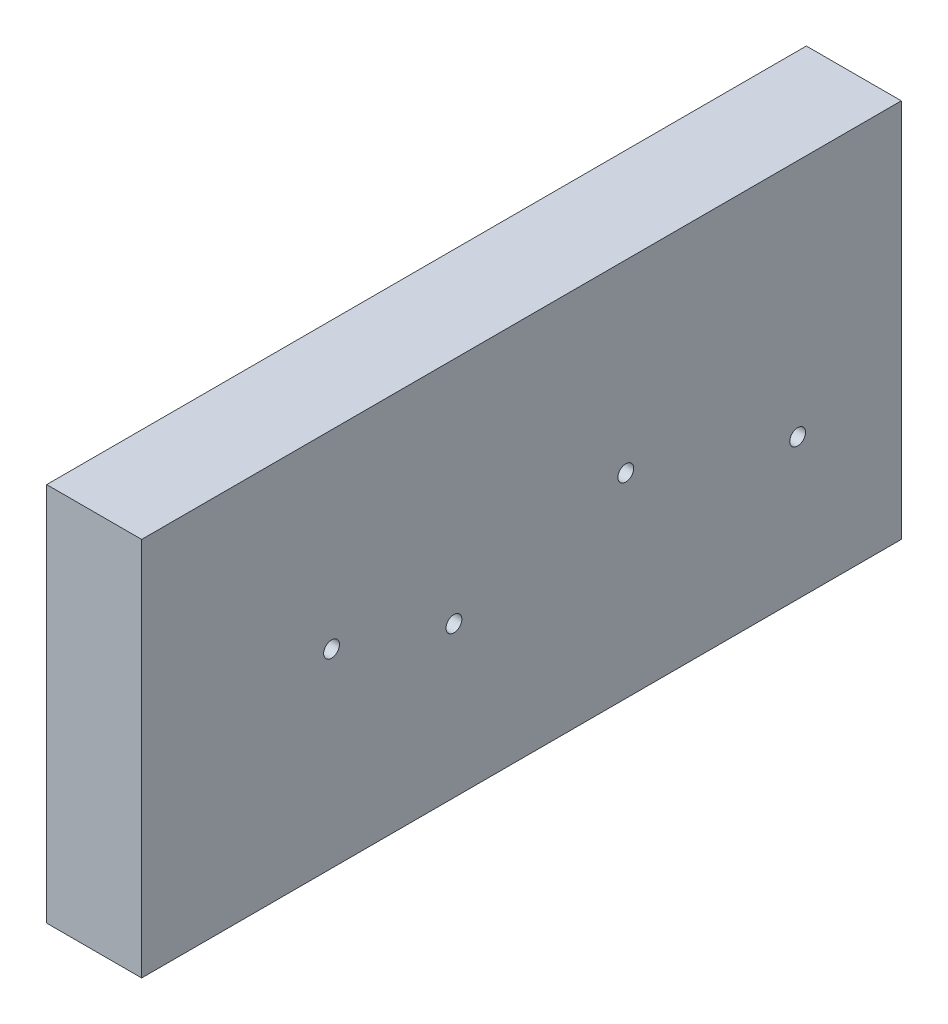
ISO-10303-21;
HEADER;
FILE_DESCRIPTION(('STEP AP214'),'2;1');
FILE_NAME('part.step','',(''),(''),'','','');
FILE_SCHEMA(('AUTOMOTIVE_DESIGN { 1 0 10303 214 1 1 1 1 }'));
ENDSEC;
DATA;
#1=APPLICATION_CONTEXT('core data for automotive mechanical design processes');
#2=APPLICATION_PROTOCOL_DEFINITION('international standard','automotive_design',2000,#1);
#3=PRODUCT_CONTEXT('',#1,'mechanical');
#4=PRODUCT('Part','Part','',(#3));
#5=PRODUCT_RELATED_PRODUCT_CATEGORY('part','',(#4));
#6=PRODUCT_DEFINITION_FORMATION('','',#4);
#7=PRODUCT_DEFINITION_CONTEXT('part definition',#1,'design');
#8=PRODUCT_DEFINITION('design','',#6,#7);
#9=PRODUCT_DEFINITION_SHAPE('','',#8);
#10=(LENGTH_UNIT() NAMED_UNIT(*) SI_UNIT(.MILLI.,.METRE.));
#11=(NAMED_UNIT(*) PLANE_ANGLE_UNIT() SI_UNIT($,.RADIAN.));
#12=(NAMED_UNIT(*) SI_UNIT($,.STERADIAN.) SOLID_ANGLE_UNIT());
#13=UNCERTAINTY_MEASURE_WITH_UNIT(LENGTH_MEASURE(1.E-05),#10,'distance_accuracy_value','');
#14=(GEOMETRIC_REPRESENTATION_CONTEXT(3) GLOBAL_UNCERTAINTY_ASSIGNED_CONTEXT((#13)) GLOBAL_UNIT_ASSIGNED_CONTEXT((#10,
#11,#12)) REPRESENTATION_CONTEXT('',''));
#15=CARTESIAN_POINT('',(0.,0.,0.));
#16=DIRECTION('',(0.,0.,1.));
#17=DIRECTION('',(1.,0.,0.));
#18=AXIS2_PLACEMENT_3D('',#15,#16,#17);
#19=CARTESIAN_POINT('',(19.05,-9.873506971,-55.404));
#20=DIRECTION('',(-1.,0.,0.));
#21=DIRECTION('',(0.,0.,1.));
#22=AXIS2_PLACEMENT_3D('',#19,#20,#21);
#23=CYLINDRICAL_SURFACE('',#22,1.5875);
#24=CARTESIAN_POINT('',(19.05,-9.873506971,-55.404));
#25=DIRECTION('',(1.,0.,0.));
#26=DIRECTION('',(0.,0.,-1.));
#27=AXIS2_PLACEMENT_3D('',#24,#25,#26);
#28=CIRCLE('',#27,1.5875);
#29=CARTESIAN_POINT('',(19.05,-9.873506971,-53.8165));
#30=VERTEX_POINT('',#29);
#31=EDGE_CURVE('E191',#30,#30,#28,.T.);
#32=CARTESIAN_POINT('',(6.35,-9.873506971,-55.404));
#33=DIRECTION('',(-1.,0.,0.));
#34=DIRECTION('',(0.,0.,1.));
#35=AXIS2_PLACEMENT_3D('',#32,#33,#34);
#36=CIRCLE('',#35,1.5875);
#37=CARTESIAN_POINT('',(6.35,-9.873506971,-53.8165));
#38=VERTEX_POINT('',#37);
#39=EDGE_CURVE('E51',#38,#38,#36,.T.);
#40=CARTESIAN_POINT('',(19.05,-9.873506971,-53.8165));
#41=CARTESIAN_POINT('',(18.9177083333333,-9.873506971,-53.8165));
#42=CARTESIAN_POINT('',(18.7854166666667,-9.873506971,-53.8165));
#43=CARTESIAN_POINT('',(18.5208333333333,-9.873506971,-53.8165));
#44=CARTESIAN_POINT('',(18.3885416666667,-9.873506971,-53.8165));
#45=CARTESIAN_POINT('',(18.1239583333333,-9.873506971,-53.8165));
#46=CARTESIAN_POINT('',(17.9916666666667,-9.873506971,-53.8165));
#47=CARTESIAN_POINT('',(17.7270833333333,-9.873506971,-53.8165));
#48=CARTESIAN_POINT('',(17.5947916666667,-9.873506971,-53.8165));
#49=CARTESIAN_POINT('',(17.3302083333333,-9.873506971,-53.8165));
#50=CARTESIAN_POINT('',(17.1979166666667,-9.873506971,-53.8165));
#51=CARTESIAN_POINT('',(16.9333333333333,-9.873506971,-53.8165));
#52=CARTESIAN_POINT('',(16.8010416666667,-9.873506971,-53.8165));
#53=CARTESIAN_POINT('',(16.5364583333333,-9.873506971,-53.8165));
#54=CARTESIAN_POINT('',(16.4041666666667,-9.873506971,-53.8165));
#55=CARTESIAN_POINT('',(16.1395833333333,-9.873506971,-53.8165));
#56=CARTESIAN_POINT('',(16.0072916666667,-9.873506971,-53.8165));
#57=CARTESIAN_POINT('',(15.7427083333333,-9.873506971,-53.8165));
#58=CARTESIAN_POINT('',(15.6104166666667,-9.873506971,-53.8165));
#59=CARTESIAN_POINT('',(15.3458333333333,-9.873506971,-53.8165));
#60=CARTESIAN_POINT('',(15.2135416666667,-9.873506971,-53.8165));
#61=CARTESIAN_POINT('',(14.9489583333333,-9.873506971,-53.8165));
#62=CARTESIAN_POINT('',(14.8166666666667,-9.873506971,-53.8165));
#63=CARTESIAN_POINT('',(14.5520833333333,-9.873506971,-53.8165));
#64=CARTESIAN_POINT('',(14.4197916666667,-9.873506971,-53.8165));
#65=CARTESIAN_POINT('',(14.1552083333333,-9.873506971,-53.8165));
#66=CARTESIAN_POINT('',(14.0229166666667,-9.873506971,-53.8165));
#67=CARTESIAN_POINT('',(13.7583333333333,-9.873506971,-53.8165));
#68=CARTESIAN_POINT('',(13.6260416666667,-9.873506971,-53.8165));
#69=CARTESIAN_POINT('',(13.3614583333333,-9.873506971,-53.8165));
#70=CARTESIAN_POINT('',(13.2291666666667,-9.873506971,-53.8165));
#71=CARTESIAN_POINT('',(12.9645833333333,-9.873506971,-53.8165));
#72=CARTESIAN_POINT('',(12.8322916666667,-9.873506971,-53.8165));
#73=CARTESIAN_POINT('',(12.5677083333333,-9.873506971,-53.8165));
#74=CARTESIAN_POINT('',(12.4354166666667,-9.873506971,-53.8165));
#75=CARTESIAN_POINT('',(12.1708333333333,-9.873506971,-53.8165));
#76=CARTESIAN_POINT('',(12.0385416666667,-9.873506971,-53.8165));
#77=CARTESIAN_POINT('',(11.7739583333333,-9.873506971,-53.8165));
#78=CARTESIAN_POINT('',(11.6416666666667,-9.873506971,-53.8165));
#79=CARTESIAN_POINT('',(11.3770833333333,-9.873506971,-53.8165));
#80=CARTESIAN_POINT('',(11.2447916666667,-9.873506971,-53.8165));
#81=CARTESIAN_POINT('',(10.9802083333333,-9.873506971,-53.8165));
#82=CARTESIAN_POINT('',(10.8479166666667,-9.873506971,-53.8165));
#83=CARTESIAN_POINT('',(10.5833333333333,-9.873506971,-53.8165));
#84=CARTESIAN_POINT('',(10.4510416666667,-9.873506971,-53.8165));
#85=CARTESIAN_POINT('',(10.1864583333333,-9.873506971,-53.8165));
#86=CARTESIAN_POINT('',(10.0541666666667,-9.873506971,-53.8165));
#87=CARTESIAN_POINT('',(9.78958333333333,-9.873506971,-53.8165));
#88=CARTESIAN_POINT('',(9.65729166666667,-9.873506971,-53.8165));
#89=CARTESIAN_POINT('',(9.39270833333333,-9.873506971,-53.8165));
#90=CARTESIAN_POINT('',(9.26041666666667,-9.873506971,-53.8165));
#91=CARTESIAN_POINT('',(8.99583333333333,-9.873506971,-53.8165));
#92=CARTESIAN_POINT('',(8.86354166666667,-9.873506971,-53.8165));
#93=CARTESIAN_POINT('',(8.59895833333333,-9.873506971,-53.8165));
#94=CARTESIAN_POINT('',(8.46666666666667,-9.873506971,-53.8165));
#95=CARTESIAN_POINT('',(8.20208333333333,-9.873506971,-53.8165));
#96=CARTESIAN_POINT('',(8.06979166666667,-9.873506971,-53.8165));
#97=CARTESIAN_POINT('',(7.80520833333333,-9.873506971,-53.8165));
#98=CARTESIAN_POINT('',(7.67291666666667,-9.873506971,-53.8165));
#99=CARTESIAN_POINT('',(7.40833333333333,-9.873506971,-53.8165));
#100=CARTESIAN_POINT('',(7.27604166666667,-9.873506971,-53.8165));
#101=CARTESIAN_POINT('',(7.01145833333333,-9.873506971,-53.8165));
#102=CARTESIAN_POINT('',(6.87916666666667,-9.873506971,-53.8165));
#103=CARTESIAN_POINT('',(6.61458333333333,-9.873506971,-53.8165));
#104=CARTESIAN_POINT('',(6.48229166666667,-9.873506971,-53.8165));
#105=CARTESIAN_POINT('',(6.35,-9.873506971,-53.8165));
#106=B_SPLINE_CURVE_WITH_KNOTS('',3,(#40,#41,#42,#43,#44,#45,#46,#47,#48,#49,#50,#51,#52,#53,
#54,#55,#56,#57,#58,#59,#60,#61,#62,#63,#64,#65,#66,#67,#68,#69,#70,#71,#72,#73,#74,#75,#76,#77,
#78,#79,#80,#81,#82,#83,#84,#85,#86,#87,#88,#89,#90,#91,#92,#93,#94,#95,#96,#97,#98,#99,#100,
#101,#102,#103,#104,#105),.UNSPECIFIED.,.F.,.F.,(4,2,2,2,2,2,2,2,2,2,2,2,2,2,2,2,2,2,2,2,2,2,2,
2,2,2,2,2,2,2,2,2,4),(0.,0.396875000000001,0.793750000000003,1.190625,1.5875,1.984375,2.38125,
2.778125,3.175,3.571875,3.96875,4.365625,4.7625,5.159375,5.55625,5.953125,6.35,6.746875,7.14375,
7.540625,7.9375,8.334375,8.73125,9.128125,9.525,9.921875,10.31875,10.715625,11.1125,11.509375,
11.90625,12.303125,12.7),.UNSPECIFIED.);
#107=EDGE_CURVE('BSEAM47',#30,#38,#106,.T.);
#108=ORIENTED_EDGE('',*,*,#31,.T.);
#109=ORIENTED_EDGE('',*,*,#39,.T.);
#110=ORIENTED_EDGE('',*,*,#107,.T.);
#111=ORIENTED_EDGE('',*,*,#107,.F.);
#112=EDGE_LOOP('',(#108,#110,#109,#111));
#113=FACE_BOUND('',#112,.T.);
#114=ADVANCED_FACE('F47',(#113),#23,.F.);
#115=CARTESIAN_POINT('',(19.05,0.,38.1));
#116=DIRECTION('',(-1.,0.,0.));
#117=DIRECTION('',(0.,0.,1.));
#118=AXIS2_PLACEMENT_3D('',#115,#116,#117);
#119=CYLINDRICAL_SURFACE('',#118,1.5875);
#120=CARTESIAN_POINT('',(19.05,0.,38.1));
#121=DIRECTION('',(1.,0.,0.));
#122=DIRECTION('',(0.,0.,-1.));
#123=AXIS2_PLACEMENT_3D('',#120,#121,#122);
#124=CIRCLE('',#123,1.5875);
#125=CARTESIAN_POINT('',(19.05,0.,39.6875));
#126=VERTEX_POINT('',#125);
#127=EDGE_CURVE('E187',#126,#126,#124,.T.);
#128=CARTESIAN_POINT('',(6.35,0.,38.1));
#129=DIRECTION('',(-1.,0.,0.));
#130=DIRECTION('',(0.,0.,1.));
#131=AXIS2_PLACEMENT_3D('',#128,#129,#130);
#132=CIRCLE('',#131,1.5875);
#133=CARTESIAN_POINT('',(6.35,0.,39.6875));
#134=VERTEX_POINT('',#133);
#135=EDGE_CURVE('E225',#134,#134,#132,.T.);
#136=CARTESIAN_POINT('',(19.05,0.,39.6875));
#137=CARTESIAN_POINT('',(18.9177083333333,0.,39.6875));
#138=CARTESIAN_POINT('',(18.7854166666667,0.,39.6875));
#139=CARTESIAN_POINT('',(18.5208333333333,0.,39.6875));
#140=CARTESIAN_POINT('',(18.3885416666667,0.,39.6875));
#141=CARTESIAN_POINT('',(18.1239583333333,0.,39.6875));
#142=CARTESIAN_POINT('',(17.9916666666667,0.,39.6875));
#143=CARTESIAN_POINT('',(17.7270833333333,0.,39.6875));
#144=CARTESIAN_POINT('',(17.5947916666667,0.,39.6875));
#145=CARTESIAN_POINT('',(17.3302083333333,0.,39.6875));
#146=CARTESIAN_POINT('',(17.1979166666667,0.,39.6875));
#147=CARTESIAN_POINT('',(16.9333333333333,0.,39.6875));
#148=CARTESIAN_POINT('',(16.8010416666667,0.,39.6875));
#149=CARTESIAN_POINT('',(16.5364583333333,0.,39.6875));
#150=CARTESIAN_POINT('',(16.4041666666667,0.,39.6875));
#151=CARTESIAN_POINT('',(16.1395833333333,0.,39.6875));
#152=CARTESIAN_POINT('',(16.0072916666667,0.,39.6875));
#153=CARTESIAN_POINT('',(15.7427083333333,0.,39.6875));
#154=CARTESIAN_POINT('',(15.6104166666667,0.,39.6875));
#155=CARTESIAN_POINT('',(15.3458333333333,0.,39.6875));
#156=CARTESIAN_POINT('',(15.2135416666667,0.,39.6875));
#157=CARTESIAN_POINT('',(14.9489583333333,0.,39.6875));
#158=CARTESIAN_POINT('',(14.8166666666667,0.,39.6875));
#159=CARTESIAN_POINT('',(14.5520833333333,0.,39.6875));
#160=CARTESIAN_POINT('',(14.4197916666667,0.,39.6875));
#161=CARTESIAN_POINT('',(14.1552083333333,0.,39.6875));
#162=CARTESIAN_POINT('',(14.0229166666667,0.,39.6875));
#163=CARTESIAN_POINT('',(13.7583333333333,0.,39.6875));
#164=CARTESIAN_POINT('',(13.6260416666667,0.,39.6875));
#165=CARTESIAN_POINT('',(13.3614583333333,0.,39.6875));
#166=CARTESIAN_POINT('',(13.2291666666667,0.,39.6875));
#167=CARTESIAN_POINT('',(12.9645833333333,0.,39.6875));
#168=CARTESIAN_POINT('',(12.8322916666667,0.,39.6875));
#169=CARTESIAN_POINT('',(12.5677083333333,0.,39.6875));
#170=CARTESIAN_POINT('',(12.4354166666667,0.,39.6875));
#171=CARTESIAN_POINT('',(12.1708333333333,0.,39.6875));
#172=CARTESIAN_POINT('',(12.0385416666667,0.,39.6875));
#173=CARTESIAN_POINT('',(11.7739583333333,0.,39.6875));
#174=CARTESIAN_POINT('',(11.6416666666667,0.,39.6875));
#175=CARTESIAN_POINT('',(11.3770833333333,0.,39.6875));
#176=CARTESIAN_POINT('',(11.2447916666667,0.,39.6875));
#177=CARTESIAN_POINT('',(10.9802083333333,0.,39.6875));
#178=CARTESIAN_POINT('',(10.8479166666667,0.,39.6875));
#179=CARTESIAN_POINT('',(10.5833333333333,0.,39.6875));
#180=CARTESIAN_POINT('',(10.4510416666667,0.,39.6875));
#181=CARTESIAN_POINT('',(10.1864583333333,0.,39.6875));
#182=CARTESIAN_POINT('',(10.0541666666667,0.,39.6875));
#183=CARTESIAN_POINT('',(9.78958333333333,0.,39.6875));
#184=CARTESIAN_POINT('',(9.65729166666667,0.,39.6875));
#185=CARTESIAN_POINT('',(9.39270833333333,0.,39.6875));
#186=CARTESIAN_POINT('',(9.26041666666667,0.,39.6875));
#187=CARTESIAN_POINT('',(8.99583333333333,0.,39.6875));
#188=CARTESIAN_POINT('',(8.86354166666667,0.,39.6875));
#189=CARTESIAN_POINT('',(8.59895833333333,0.,39.6875));
#190=CARTESIAN_POINT('',(8.46666666666667,0.,39.6875));
#191=CARTESIAN_POINT('',(8.20208333333333,0.,39.6875));
#192=CARTESIAN_POINT('',(8.06979166666667,0.,39.6875));
#193=CARTESIAN_POINT('',(7.80520833333333,0.,39.6875));
#194=CARTESIAN_POINT('',(7.67291666666667,0.,39.6875));
#195=CARTESIAN_POINT('',(7.40833333333333,0.,39.6875));
#196=CARTESIAN_POINT('',(7.27604166666667,0.,39.6875));
#197=CARTESIAN_POINT('',(7.01145833333333,0.,39.6875));
#198=CARTESIAN_POINT('',(6.87916666666667,0.,39.6875));
#199=CARTESIAN_POINT('',(6.61458333333333,0.,39.6875));
#200=CARTESIAN_POINT('',(6.48229166666667,0.,39.6875));
#201=CARTESIAN_POINT('',(6.35,0.,39.6875));
#202=B_SPLINE_CURVE_WITH_KNOTS('',3,(#136,#137,#138,#139,#140,#141,#142,#143,#144,#145,#146,
#147,#148,#149,#150,#151,#152,#153,#154,#155,#156,#157,#158,#159,#160,#161,#162,#163,#164,#165,
#166,#167,#168,#169,#170,#171,#172,#173,#174,#175,#176,#177,#178,#179,#180,#181,#182,#183,#184,
#185,#186,#187,#188,#189,#190,#191,#192,#193,#194,#195,#196,#197,#198,#199,#200,#201),
.UNSPECIFIED.,.F.,.F.,(4,2,2,2,2,2,2,2,2,2,2,2,2,2,2,2,2,2,2,2,2,2,2,2,2,2,2,2,2,2,2,2,4),(0.,
0.396875000000001,0.793750000000003,1.190625,1.5875,1.984375,2.38125,2.778125,3.175,3.571875,
3.96875,4.365625,4.7625,5.159375,5.55625,5.953125,6.35,6.746875,7.14375,7.540625,7.9375,
8.334375,8.73125,9.128125,9.525,9.921875,10.31875,10.715625,11.1125,11.509375,11.90625,
12.303125,12.7),.UNSPECIFIED.);
#203=EDGE_CURVE('BSEAM270',#126,#134,#202,.T.);
#204=ORIENTED_EDGE('',*,*,#127,.T.);
#205=ORIENTED_EDGE('',*,*,#135,.T.);
#206=ORIENTED_EDGE('',*,*,#203,.T.);
#207=ORIENTED_EDGE('',*,*,#203,.F.);
#208=EDGE_LOOP('',(#204,#206,#205,#207));
#209=FACE_BOUND('',#208,.T.);
#210=ADVANCED_FACE('F270',(#209),#119,.F.);
#211=CARTESIAN_POINT('',(19.05,1.096077429,-20.927));
#212=DIRECTION('',(-1.,0.,0.));
#213=DIRECTION('',(0.,0.,1.));
#214=AXIS2_PLACEMENT_3D('',#211,#212,#213);
#215=CYLINDRICAL_SURFACE('',#214,1.5875);
#216=CARTESIAN_POINT('',(19.05,1.096077429,-20.927));
#217=DIRECTION('',(1.,0.,0.));
#218=DIRECTION('',(0.,0.,-1.));
#219=AXIS2_PLACEMENT_3D('',#216,#217,#218);
#220=CIRCLE('',#219,1.5875);
#221=CARTESIAN_POINT('',(19.05,1.096077429,-19.3395));
#222=VERTEX_POINT('',#221);
#223=EDGE_CURVE('E170',#222,#222,#220,.T.);
#224=CARTESIAN_POINT('',(6.35,1.096077429,-20.927));
#225=DIRECTION('',(-1.,0.,0.));
#226=DIRECTION('',(0.,0.,1.));
#227=AXIS2_PLACEMENT_3D('',#224,#225,#226);
#228=CIRCLE('',#227,1.5875);
#229=CARTESIAN_POINT('',(6.35,1.096077429,-19.3395));
#230=VERTEX_POINT('',#229);
#231=EDGE_CURVE('E222',#230,#230,#228,.T.);
#232=CARTESIAN_POINT('',(19.05,1.096077429,-19.3395));
#233=CARTESIAN_POINT('',(18.9177083333333,1.096077429,-19.3395));
#234=CARTESIAN_POINT('',(18.7854166666667,1.096077429,-19.3395));
#235=CARTESIAN_POINT('',(18.5208333333333,1.096077429,-19.3395));
#236=CARTESIAN_POINT('',(18.3885416666667,1.096077429,-19.3395));
#237=CARTESIAN_POINT('',(18.1239583333333,1.096077429,-19.3395));
#238=CARTESIAN_POINT('',(17.9916666666667,1.096077429,-19.3395));
#239=CARTESIAN_POINT('',(17.7270833333333,1.096077429,-19.3395));
#240=CARTESIAN_POINT('',(17.5947916666667,1.096077429,-19.3395));
#241=CARTESIAN_POINT('',(17.3302083333333,1.096077429,-19.3395));
#242=CARTESIAN_POINT('',(17.1979166666667,1.096077429,-19.3395));
#243=CARTESIAN_POINT('',(16.9333333333333,1.096077429,-19.3395));
#244=CARTESIAN_POINT('',(16.8010416666667,1.096077429,-19.3395));
#245=CARTESIAN_POINT('',(16.5364583333333,1.096077429,-19.3395));
#246=CARTESIAN_POINT('',(16.4041666666667,1.096077429,-19.3395));
#247=CARTESIAN_POINT('',(16.1395833333333,1.096077429,-19.3395));
#248=CARTESIAN_POINT('',(16.0072916666667,1.096077429,-19.3395));
#249=CARTESIAN_POINT('',(15.7427083333333,1.096077429,-19.3395));
#250=CARTESIAN_POINT('',(15.6104166666667,1.096077429,-19.3395));
#251=CARTESIAN_POINT('',(15.3458333333333,1.096077429,-19.3395));
#252=CARTESIAN_POINT('',(15.2135416666667,1.096077429,-19.3395));
#253=CARTESIAN_POINT('',(14.9489583333333,1.096077429,-19.3395));
#254=CARTESIAN_POINT('',(14.8166666666667,1.096077429,-19.3395));
#255=CARTESIAN_POINT('',(14.5520833333333,1.096077429,-19.3395));
#256=CARTESIAN_POINT('',(14.4197916666667,1.096077429,-19.3395));
#257=CARTESIAN_POINT('',(14.1552083333333,1.096077429,-19.3395));
#258=CARTESIAN_POINT('',(14.0229166666667,1.096077429,-19.3395));
#259=CARTESIAN_POINT('',(13.7583333333333,1.096077429,-19.3395));
#260=CARTESIAN_POINT('',(13.6260416666667,1.096077429,-19.3395));
#261=CARTESIAN_POINT('',(13.3614583333333,1.096077429,-19.3395));
#262=CARTESIAN_POINT('',(13.2291666666667,1.096077429,-19.3395));
#263=CARTESIAN_POINT('',(12.9645833333333,1.096077429,-19.3395));
#264=CARTESIAN_POINT('',(12.8322916666667,1.096077429,-19.3395));
#265=CARTESIAN_POINT('',(12.5677083333333,1.096077429,-19.3395));
#266=CARTESIAN_POINT('',(12.4354166666667,1.096077429,-19.3395));
#267=CARTESIAN_POINT('',(12.1708333333333,1.096077429,-19.3395));
#268=CARTESIAN_POINT('',(12.0385416666667,1.096077429,-19.3395));
#269=CARTESIAN_POINT('',(11.7739583333333,1.096077429,-19.3395));
#270=CARTESIAN_POINT('',(11.6416666666667,1.096077429,-19.3395));
#271=CARTESIAN_POINT('',(11.3770833333333,1.096077429,-19.3395));
#272=CARTESIAN_POINT('',(11.2447916666667,1.096077429,-19.3395));
#273=CARTESIAN_POINT('',(10.9802083333333,1.096077429,-19.3395));
#274=CARTESIAN_POINT('',(10.8479166666667,1.096077429,-19.3395));
#275=CARTESIAN_POINT('',(10.5833333333333,1.096077429,-19.3395));
#276=CARTESIAN_POINT('',(10.4510416666667,1.096077429,-19.3395));
#277=CARTESIAN_POINT('',(10.1864583333333,1.096077429,-19.3395));
#278=CARTESIAN_POINT('',(10.0541666666667,1.096077429,-19.3395));
#279=CARTESIAN_POINT('',(9.78958333333333,1.096077429,-19.3395));
#280=CARTESIAN_POINT('',(9.65729166666667,1.096077429,-19.3395));
#281=CARTESIAN_POINT('',(9.39270833333333,1.096077429,-19.3395));
#282=CARTESIAN_POINT('',(9.26041666666667,1.096077429,-19.3395));
#283=CARTESIAN_POINT('',(8.99583333333333,1.096077429,-19.3395));
#284=CARTESIAN_POINT('',(8.86354166666667,1.096077429,-19.3395));
#285=CARTESIAN_POINT('',(8.59895833333333,1.096077429,-19.3395));
#286=CARTESIAN_POINT('',(8.46666666666667,1.096077429,-19.3395));
#287=CARTESIAN_POINT('',(8.20208333333333,1.096077429,-19.3395));
#288=CARTESIAN_POINT('',(8.06979166666667,1.096077429,-19.3395));
#289=CARTESIAN_POINT('',(7.80520833333333,1.096077429,-19.3395));
#290=CARTESIAN_POINT('',(7.67291666666667,1.096077429,-19.3395));
#291=CARTESIAN_POINT('',(7.40833333333333,1.096077429,-19.3395));
#292=CARTESIAN_POINT('',(7.27604166666667,1.096077429,-19.3395));
#293=CARTESIAN_POINT('',(7.01145833333333,1.096077429,-19.3395));
#294=CARTESIAN_POINT('',(6.87916666666667,1.096077429,-19.3395));
#295=CARTESIAN_POINT('',(6.61458333333333,1.096077429,-19.3395));
#296=CARTESIAN_POINT('',(6.48229166666667,1.096077429,-19.3395));
#297=CARTESIAN_POINT('',(6.35,1.096077429,-19.3395));
#298=B_SPLINE_CURVE_WITH_KNOTS('',3,(#232,#233,#234,#235,#236,#237,#238,#239,#240,#241,#242,
#243,#244,#245,#246,#247,#248,#249,#250,#251,#252,#253,#254,#255,#256,#257,#258,#259,#260,#261,
#262,#263,#264,#265,#266,#267,#268,#269,#270,#271,#272,#273,#274,#275,#276,#277,#278,#279,#280,
#281,#282,#283,#284,#285,#286,#287,#288,#289,#290,#291,#292,#293,#294,#295,#296,#297),
.UNSPECIFIED.,.F.,.F.,(4,2,2,2,2,2,2,2,2,2,2,2,2,2,2,2,2,2,2,2,2,2,2,2,2,2,2,2,2,2,2,2,4),(0.,
0.396875000000001,0.793750000000003,1.190625,1.5875,1.984375,2.38125,2.778125,3.175,3.571875,
3.96875,4.365625,4.7625,5.159375,5.55625,5.953125,6.35,6.746875,7.14375,7.540625,7.9375,
8.334375,8.73125,9.128125,9.525,9.921875,10.31875,10.715625,11.1125,11.509375,11.90625,
12.303125,12.7),.UNSPECIFIED.);
#299=EDGE_CURVE('BSEAM49',#222,#230,#298,.T.);
#300=ORIENTED_EDGE('',*,*,#223,.T.);
#301=ORIENTED_EDGE('',*,*,#231,.T.);
#302=ORIENTED_EDGE('',*,*,#299,.T.);
#303=ORIENTED_EDGE('',*,*,#299,.F.);
#304=EDGE_LOOP('',(#300,#302,#301,#303));
#305=FACE_BOUND('',#304,.T.);
#306=ADVANCED_FACE('F49',(#305),#215,.F.);
#307=CARTESIAN_POINT('',(19.05,-7.860160654,13.55));
#308=DIRECTION('',(-1.,0.,0.));
#309=DIRECTION('',(0.,0.,1.));
#310=AXIS2_PLACEMENT_3D('',#307,#308,#309);
#311=CYLINDRICAL_SURFACE('',#310,1.5875);
#312=CARTESIAN_POINT('',(19.05,-7.860160654,13.55));
#313=DIRECTION('',(1.,0.,0.));
#314=DIRECTION('',(0.,0.,-1.));
#315=AXIS2_PLACEMENT_3D('',#312,#313,#314);
#316=CIRCLE('',#315,1.5875);
#317=CARTESIAN_POINT('',(19.05,-7.860160654,15.1375));
#318=VERTEX_POINT('',#317);
#319=EDGE_CURVE('E195',#318,#318,#316,.T.);
#320=CARTESIAN_POINT('',(6.35,-7.860160654,13.55));
#321=DIRECTION('',(-1.,0.,0.));
#322=DIRECTION('',(0.,0.,1.));
#323=AXIS2_PLACEMENT_3D('',#320,#321,#322);
#324=CIRCLE('',#323,1.5875);
#325=CARTESIAN_POINT('',(6.35,-7.860160654,15.1375));
#326=VERTEX_POINT('',#325);
#327=EDGE_CURVE('E142',#326,#326,#324,.T.);
#328=CARTESIAN_POINT('',(19.05,-7.860160654,15.1375));
#329=CARTESIAN_POINT('',(18.9177083333333,-7.860160654,15.1375));
#330=CARTESIAN_POINT('',(18.7854166666667,-7.860160654,15.1375));
#331=CARTESIAN_POINT('',(18.5208333333333,-7.860160654,15.1375));
#332=CARTESIAN_POINT('',(18.3885416666667,-7.860160654,15.1375));
#333=CARTESIAN_POINT('',(18.1239583333333,-7.860160654,15.1375));
#334=CARTESIAN_POINT('',(17.9916666666667,-7.860160654,15.1375));
#335=CARTESIAN_POINT('',(17.7270833333333,-7.860160654,15.1375));
#336=CARTESIAN_POINT('',(17.5947916666667,-7.860160654,15.1375));
#337=CARTESIAN_POINT('',(17.3302083333333,-7.860160654,15.1375));
#338=CARTESIAN_POINT('',(17.1979166666667,-7.860160654,15.1375));
#339=CARTESIAN_POINT('',(16.9333333333333,-7.860160654,15.1375));
#340=CARTESIAN_POINT('',(16.8010416666667,-7.860160654,15.1375));
#341=CARTESIAN_POINT('',(16.5364583333333,-7.860160654,15.1375));
#342=CARTESIAN_POINT('',(16.4041666666667,-7.860160654,15.1375));
#343=CARTESIAN_POINT('',(16.1395833333333,-7.860160654,15.1375));
#344=CARTESIAN_POINT('',(16.0072916666667,-7.860160654,15.1375));
#345=CARTESIAN_POINT('',(15.7427083333333,-7.860160654,15.1375));
#346=CARTESIAN_POINT('',(15.6104166666667,-7.860160654,15.1375));
#347=CARTESIAN_POINT('',(15.3458333333333,-7.860160654,15.1375));
#348=CARTESIAN_POINT('',(15.2135416666667,-7.860160654,15.1375));
#349=CARTESIAN_POINT('',(14.9489583333333,-7.860160654,15.1375));
#350=CARTESIAN_POINT('',(14.8166666666667,-7.860160654,15.1375));
#351=CARTESIAN_POINT('',(14.5520833333333,-7.860160654,15.1375));
#352=CARTESIAN_POINT('',(14.4197916666667,-7.860160654,15.1375));
#353=CARTESIAN_POINT('',(14.1552083333333,-7.860160654,15.1375));
#354=CARTESIAN_POINT('',(14.0229166666667,-7.860160654,15.1375));
#355=CARTESIAN_POINT('',(13.7583333333333,-7.860160654,15.1375));
#356=CARTESIAN_POINT('',(13.6260416666667,-7.860160654,15.1375));
#357=CARTESIAN_POINT('',(13.3614583333333,-7.860160654,15.1375));
#358=CARTESIAN_POINT('',(13.2291666666667,-7.860160654,15.1375));
#359=CARTESIAN_POINT('',(12.9645833333333,-7.860160654,15.1375));
#360=CARTESIAN_POINT('',(12.8322916666667,-7.860160654,15.1375));
#361=CARTESIAN_POINT('',(12.5677083333333,-7.860160654,15.1375));
#362=CARTESIAN_POINT('',(12.4354166666667,-7.860160654,15.1375));
#363=CARTESIAN_POINT('',(12.1708333333333,-7.860160654,15.1375));
#364=CARTESIAN_POINT('',(12.0385416666667,-7.860160654,15.1375));
#365=CARTESIAN_POINT('',(11.7739583333333,-7.860160654,15.1375));
#366=CARTESIAN_POINT('',(11.6416666666667,-7.860160654,15.1375));
#367=CARTESIAN_POINT('',(11.3770833333333,-7.860160654,15.1375));
#368=CARTESIAN_POINT('',(11.2447916666667,-7.860160654,15.1375));
#369=CARTESIAN_POINT('',(10.9802083333333,-7.860160654,15.1375));
#370=CARTESIAN_POINT('',(10.8479166666667,-7.860160654,15.1375));
#371=CARTESIAN_POINT('',(10.5833333333333,-7.860160654,15.1375));
#372=CARTESIAN_POINT('',(10.4510416666667,-7.860160654,15.1375));
#373=CARTESIAN_POINT('',(10.1864583333333,-7.860160654,15.1375));
#374=CARTESIAN_POINT('',(10.0541666666667,-7.860160654,15.1375));
#375=CARTESIAN_POINT('',(9.78958333333333,-7.860160654,15.1375));
#376=CARTESIAN_POINT('',(9.65729166666667,-7.860160654,15.1375));
#377=CARTESIAN_POINT('',(9.39270833333333,-7.860160654,15.1375));
#378=CARTESIAN_POINT('',(9.26041666666667,-7.860160654,15.1375));
#379=CARTESIAN_POINT('',(8.99583333333333,-7.860160654,15.1375));
#380=CARTESIAN_POINT('',(8.86354166666667,-7.860160654,15.1375));
#381=CARTESIAN_POINT('',(8.59895833333333,-7.860160654,15.1375));
#382=CARTESIAN_POINT('',(8.46666666666667,-7.860160654,15.1375));
#383=CARTESIAN_POINT('',(8.20208333333333,-7.860160654,15.1375));
#384=CARTESIAN_POINT('',(8.06979166666667,-7.860160654,15.1375));
#385=CARTESIAN_POINT('',(7.80520833333333,-7.860160654,15.1375));
#386=CARTESIAN_POINT('',(7.67291666666667,-7.860160654,15.1375));
#387=CARTESIAN_POINT('',(7.40833333333333,-7.860160654,15.1375));
#388=CARTESIAN_POINT('',(7.27604166666667,-7.860160654,15.1375));
#389=CARTESIAN_POINT('',(7.01145833333333,-7.860160654,15.1375));
#390=CARTESIAN_POINT('',(6.87916666666667,-7.860160654,15.1375));
#391=CARTESIAN_POINT('',(6.61458333333333,-7.860160654,15.1375));
#392=CARTESIAN_POINT('',(6.48229166666667,-7.860160654,15.1375));
#393=CARTESIAN_POINT('',(6.35,-7.860160654,15.1375));
#394=B_SPLINE_CURVE_WITH_KNOTS('',3,(#328,#329,#330,#331,#332,#333,#334,#335,#336,#337,#338,
#339,#340,#341,#342,#343,#344,#345,#346,#347,#348,#349,#350,#351,#352,#353,#354,#355,#356,#357,
#358,#359,#360,#361,#362,#363,#364,#365,#366,#367,#368,#369,#370,#371,#372,#373,#374,#375,#376,
#377,#378,#379,#380,#381,#382,#383,#384,#385,#386,#387,#388,#389,#390,#391,#392,#393),
.UNSPECIFIED.,.F.,.F.,(4,2,2,2,2,2,2,2,2,2,2,2,2,2,2,2,2,2,2,2,2,2,2,2,2,2,2,2,2,2,2,2,4),(0.,
0.396875000000001,0.793750000000003,1.190625,1.5875,1.984375,2.38125,2.778125,3.175,3.571875,
3.96875,4.365625,4.7625,5.159375,5.55625,5.953125,6.35,6.746875,7.14375,7.540625,7.9375,
8.334375,8.73125,9.128125,9.525,9.921875,10.31875,10.715625,11.1125,11.509375,11.90625,
12.303125,12.7),.UNSPECIFIED.);
#395=EDGE_CURVE('BSEAM278',#318,#326,#394,.T.);
#396=ORIENTED_EDGE('',*,*,#319,.T.);
#397=ORIENTED_EDGE('',*,*,#327,.T.);
#398=ORIENTED_EDGE('',*,*,#395,.T.);
#399=ORIENTED_EDGE('',*,*,#395,.F.);
#400=EDGE_LOOP('',(#396,#398,#397,#399));
#401=FACE_BOUND('',#400,.T.);
#402=ADVANCED_FACE('F278',(#401),#311,.F.);
#403=CARTESIAN_POINT('',(19.05,-38.1,0.));
#404=DIRECTION('',(0.,1.,0.));
#405=DIRECTION('',(0.,0.,1.));
#406=AXIS2_PLACEMENT_3D('',#403,#404,#405);
#407=PLANE('',#406);
#408=CARTESIAN_POINT('',(9.525,-38.1,0.));
#409=DIRECTION('',(0.,-1.,0.));
#410=DIRECTION('',(0.,0.,-1.));
#411=AXIS2_PLACEMENT_3D('',#408,#409,#410);
#412=CIRCLE('',#411,3.17499999999999);
#413=CARTESIAN_POINT('',(9.525,-38.1,-3.17499999999997));
#414=VERTEX_POINT('',#413);
#415=EDGE_CURVE('E116',#414,#414,#412,.T.);
#416=ORIENTED_EDGE('',*,*,#415,.F.);
#417=EDGE_LOOP('',(#416));
#418=FACE_BOUND('',#417,.T.);
#419=CARTESIAN_POINT('',(9.525,-38.1,57.15));
#420=DIRECTION('',(0.,-1.,0.));
#421=DIRECTION('',(0.,0.,-1.));
#422=AXIS2_PLACEMENT_3D('',#419,#420,#421);
#423=CIRCLE('',#422,3.17499999999999);
#424=CARTESIAN_POINT('',(9.525,-38.1,53.975));
#425=VERTEX_POINT('',#424);
#426=EDGE_CURVE('E115',#425,#425,#423,.T.);
#427=ORIENTED_EDGE('',*,*,#426,.F.);
#428=EDGE_LOOP('',(#427));
#429=FACE_BOUND('',#428,.T.);
#430=CARTESIAN_POINT('',(9.52500000000002,-38.1,-63.5));
#431=DIRECTION('',(0.,-1.,0.));
#432=DIRECTION('',(0.,0.,-1.));
#433=AXIS2_PLACEMENT_3D('',#430,#431,#432);
#434=CIRCLE('',#433,3.17499999999999);
#435=CARTESIAN_POINT('',(9.52500000000002,-38.1,-66.675));
#436=VERTEX_POINT('',#435);
#437=EDGE_CURVE('E129',#436,#436,#434,.T.);
#438=ORIENTED_EDGE('',*,*,#437,.F.);
#439=EDGE_LOOP('',(#438));
#440=FACE_BOUND('',#439,.T.);
#441=DIRECTION('',(0.,0.,-1.));
#442=VECTOR('',#441,1.);
#443=CARTESIAN_POINT('',(0.,-38.1,0.));
#444=LINE('',#443,#442);
#445=CARTESIAN_POINT('',(0.,-38.1,76.2));
#446=VERTEX_POINT('',#445);
#447=CARTESIAN_POINT('',(0.,-38.1,-76.2));
#448=VERTEX_POINT('',#447);
#449=EDGE_CURVE('E199',#446,#448,#444,.T.);
#450=ORIENTED_EDGE('',*,*,#449,.T.);
#451=DIRECTION('',(-1.,0.,0.));
#452=VECTOR('',#451,1.);
#453=CARTESIAN_POINT('',(19.05,-38.1,-76.2));
#454=LINE('',#453,#452);
#455=CARTESIAN_POINT('',(19.05,-38.1,-76.2));
#456=VERTEX_POINT('',#455);
#457=EDGE_CURVE('E11',#456,#448,#454,.T.);
#458=ORIENTED_EDGE('',*,*,#457,.F.);
#459=DIRECTION('',(0.,0.,-1.));
#460=VECTOR('',#459,1.);
#461=CARTESIAN_POINT('',(19.05,-38.1,0.));
#462=LINE('',#461,#460);
#463=CARTESIAN_POINT('',(19.05,-38.1,76.2));
#464=VERTEX_POINT('',#463);
#465=EDGE_CURVE('E174',#464,#456,#462,.T.);
#466=ORIENTED_EDGE('',*,*,#465,.F.);
#467=DIRECTION('',(-1.,0.,0.));
#468=VECTOR('',#467,1.);
#469=CARTESIAN_POINT('',(19.05,-38.1,76.2));
#470=LINE('',#469,#468);
#471=EDGE_CURVE('E67',#464,#446,#470,.T.);
#472=ORIENTED_EDGE('',*,*,#471,.T.);
#473=EDGE_LOOP('',(#450,#458,#466,#472));
#474=FACE_BOUND('',#473,.T.);
#475=ADVANCED_FACE('F280',(#418,#429,#440,#474),#407,.F.);
#476=CARTESIAN_POINT('',(19.05,0.,-76.2));
#477=DIRECTION('',(0.,0.,1.));
#478=DIRECTION('',(1.,0.,0.));
#479=AXIS2_PLACEMENT_3D('',#476,#477,#478);
#480=PLANE('',#479);
#481=DIRECTION('',(0.,1.,0.));
#482=VECTOR('',#481,1.);
#483=CARTESIAN_POINT('',(0.,0.,-76.2));
#484=LINE('',#483,#482);
#485=CARTESIAN_POINT('',(0.,38.1,-76.2));
#486=VERTEX_POINT('',#485);
#487=EDGE_CURVE('E202',#448,#486,#484,.T.);
#488=ORIENTED_EDGE('',*,*,#487,.T.);
#489=DIRECTION('',(-1.,0.,0.));
#490=VECTOR('',#489,1.);
#491=CARTESIAN_POINT('',(19.05,38.1,-76.2));
#492=LINE('',#491,#490);
#493=CARTESIAN_POINT('',(19.05,38.1,-76.2));
#494=VERTEX_POINT('',#493);
#495=EDGE_CURVE('E58',#494,#486,#492,.T.);
#496=ORIENTED_EDGE('',*,*,#495,.F.);
#497=DIRECTION('',(0.,1.,0.));
#498=VECTOR('',#497,1.);
#499=CARTESIAN_POINT('',(19.05,0.,-76.2));
#500=LINE('',#499,#498);
#501=EDGE_CURVE('E93',#456,#494,#500,.T.);
#502=ORIENTED_EDGE('',*,*,#501,.F.);
#503=ORIENTED_EDGE('',*,*,#457,.T.);
#504=EDGE_LOOP('',(#488,#496,#502,#503));
#505=FACE_BOUND('',#504,.T.);
#506=ADVANCED_FACE('F265',(#505),#480,.F.);
#507=CARTESIAN_POINT('',(19.05,38.1,0.));
#508=DIRECTION('',(0.,1.,0.));
#509=DIRECTION('',(0.,0.,1.));
#510=AXIS2_PLACEMENT_3D('',#507,#508,#509);
#511=PLANE('',#510);
#512=DIRECTION('',(0.,0.,-1.));
#513=VECTOR('',#512,1.);
#514=CARTESIAN_POINT('',(0.,38.1,0.));
#515=LINE('',#514,#513);
#516=CARTESIAN_POINT('',(0.,38.1,76.2));
#517=VERTEX_POINT('',#516);
#518=EDGE_CURVE('E206',#517,#486,#515,.T.);
#519=ORIENTED_EDGE('',*,*,#518,.F.);
#520=DIRECTION('',(-1.,0.,0.));
#521=VECTOR('',#520,1.);
#522=CARTESIAN_POINT('',(19.05,38.1,76.2));
#523=LINE('',#522,#521);
#524=CARTESIAN_POINT('',(19.05,38.1,76.2));
#525=VERTEX_POINT('',#524);
#526=EDGE_CURVE('E82',#525,#517,#523,.T.);
#527=ORIENTED_EDGE('',*,*,#526,.F.);
#528=DIRECTION('',(0.,0.,-1.));
#529=VECTOR('',#528,1.);
#530=CARTESIAN_POINT('',(19.05,38.1,0.));
#531=LINE('',#530,#529);
#532=EDGE_CURVE('E180',#525,#494,#531,.T.);
#533=ORIENTED_EDGE('',*,*,#532,.T.);
#534=ORIENTED_EDGE('',*,*,#495,.T.);
#535=EDGE_LOOP('',(#519,#527,#533,#534));
#536=FACE_BOUND('',#535,.T.);
#537=ADVANCED_FACE('F257',(#536),#511,.T.);
#538=CARTESIAN_POINT('',(19.05,0.,76.2));
#539=DIRECTION('',(0.,0.,1.));
#540=DIRECTION('',(1.,0.,0.));
#541=AXIS2_PLACEMENT_3D('',#538,#539,#540);
#542=PLANE('',#541);
#543=DIRECTION('',(0.,1.,0.));
#544=VECTOR('',#543,1.);
#545=CARTESIAN_POINT('',(0.,0.,76.2));
#546=LINE('',#545,#544);
#547=EDGE_CURVE('E175',#446,#517,#546,.T.);
#548=ORIENTED_EDGE('',*,*,#547,.F.);
#549=ORIENTED_EDGE('',*,*,#471,.F.);
#550=DIRECTION('',(0.,1.,0.));
#551=VECTOR('',#550,1.);
#552=CARTESIAN_POINT('',(19.05,0.,76.2));
#553=LINE('',#552,#551);
#554=EDGE_CURVE('E184',#464,#525,#553,.T.);
#555=ORIENTED_EDGE('',*,*,#554,.T.);
#556=ORIENTED_EDGE('',*,*,#526,.T.);
#557=EDGE_LOOP('',(#548,#549,#555,#556));
#558=FACE_BOUND('',#557,.T.);
#559=ADVANCED_FACE('F255',(#558),#542,.T.);
#560=CARTESIAN_POINT('',(19.05,0.,0.));
#561=DIRECTION('',(1.,0.,0.));
#562=DIRECTION('',(0.,0.,-1.));
#563=AXIS2_PLACEMENT_3D('',#560,#561,#562);
#564=PLANE('',#563);
#565=ORIENTED_EDGE('',*,*,#223,.F.);
#566=EDGE_LOOP('',(#565));
#567=FACE_BOUND('',#566,.T.);
#568=ORIENTED_EDGE('',*,*,#465,.T.);
#569=ORIENTED_EDGE('',*,*,#501,.T.);
#570=ORIENTED_EDGE('',*,*,#532,.F.);
#571=ORIENTED_EDGE('',*,*,#554,.F.);
#572=EDGE_LOOP('',(#568,#569,#570,#571));
#573=FACE_BOUND('',#572,.T.);
#574=ORIENTED_EDGE('',*,*,#127,.F.);
#575=EDGE_LOOP('',(#574));
#576=FACE_BOUND('',#575,.T.);
#577=ORIENTED_EDGE('',*,*,#31,.F.);
#578=EDGE_LOOP('',(#577));
#579=FACE_BOUND('',#578,.T.);
#580=ORIENTED_EDGE('',*,*,#319,.F.);
#581=EDGE_LOOP('',(#580));
#582=FACE_BOUND('',#581,.T.);
#583=ADVANCED_FACE('F251',(#567,#573,#576,#579,#582),#564,.T.);
#584=CARTESIAN_POINT('',(0.,0.,0.));
#585=DIRECTION('',(1.,0.,0.));
#586=DIRECTION('',(0.,0.,-1.));
#587=AXIS2_PLACEMENT_3D('',#584,#585,#586);
#588=PLANE('',#587);
#589=CARTESIAN_POINT('',(0.,0.,38.1));
#590=DIRECTION('',(-1.,0.,0.));
#591=DIRECTION('',(0.,0.,1.));
#592=AXIS2_PLACEMENT_3D('',#589,#590,#591);
#593=CIRCLE('',#592,4.7625);
#594=CARTESIAN_POINT('',(0.,0.,42.8625));
#595=VERTEX_POINT('',#594);
#596=EDGE_CURVE('E143',#595,#595,#593,.T.);
#597=ORIENTED_EDGE('',*,*,#596,.F.);
#598=EDGE_LOOP('',(#597));
#599=FACE_BOUND('',#598,.T.);
#600=CARTESIAN_POINT('',(0.,-7.860160654,13.55));
#601=DIRECTION('',(-1.,0.,0.));
#602=DIRECTION('',(0.,0.,1.));
#603=AXIS2_PLACEMENT_3D('',#600,#601,#602);
#604=CIRCLE('',#603,4.7625);
#605=CARTESIAN_POINT('',(0.,-7.860160654,18.3125));
#606=VERTEX_POINT('',#605);
#607=EDGE_CURVE('E147',#606,#606,#604,.T.);
#608=ORIENTED_EDGE('',*,*,#607,.F.);
#609=EDGE_LOOP('',(#608));
#610=FACE_BOUND('',#609,.T.);
#611=CARTESIAN_POINT('',(0.,1.096077429,-20.927));
#612=DIRECTION('',(-1.,0.,0.));
#613=DIRECTION('',(0.,0.,1.));
#614=AXIS2_PLACEMENT_3D('',#611,#612,#613);
#615=CIRCLE('',#614,4.7625);
#616=CARTESIAN_POINT('',(0.,1.096077429,-16.1645));
#617=VERTEX_POINT('',#616);
#618=EDGE_CURVE('E155',#617,#617,#615,.T.);
#619=ORIENTED_EDGE('',*,*,#618,.F.);
#620=EDGE_LOOP('',(#619));
#621=FACE_BOUND('',#620,.T.);
#622=CARTESIAN_POINT('',(0.,-9.873506971,-55.404));
#623=DIRECTION('',(-1.,0.,0.));
#624=DIRECTION('',(0.,0.,1.));
#625=AXIS2_PLACEMENT_3D('',#622,#623,#624);
#626=CIRCLE('',#625,4.7625);
#627=CARTESIAN_POINT('',(0.,-9.873506971,-50.6415));
#628=VERTEX_POINT('',#627);
#629=EDGE_CURVE('E163',#628,#628,#626,.T.);
#630=ORIENTED_EDGE('',*,*,#629,.F.);
#631=EDGE_LOOP('',(#630));
#632=FACE_BOUND('',#631,.T.);
#633=ORIENTED_EDGE('',*,*,#449,.F.);
#634=ORIENTED_EDGE('',*,*,#547,.T.);
#635=ORIENTED_EDGE('',*,*,#518,.T.);
#636=ORIENTED_EDGE('',*,*,#487,.F.);
#637=EDGE_LOOP('',(#633,#634,#635,#636));
#638=FACE_BOUND('',#637,.T.);
#639=ADVANCED_FACE('F245',(#599,#610,#621,#632,#638),#588,.F.);
#640=CARTESIAN_POINT('',(6.35,-9.873506971,-55.404));
#641=DIRECTION('',(-1.,0.,0.));
#642=DIRECTION('',(0.,0.,1.));
#643=AXIS2_PLACEMENT_3D('',#640,#641,#642);
#644=CYLINDRICAL_SURFACE('',#643,4.7625);
#645=CARTESIAN_POINT('',(6.35,-9.873506971,-55.404));
#646=DIRECTION('',(-1.,0.,0.));
#647=DIRECTION('',(0.,0.,1.));
#648=AXIS2_PLACEMENT_3D('',#645,#646,#647);
#649=CIRCLE('',#648,4.7625);
#650=CARTESIAN_POINT('',(6.35,-9.873506971,-50.6415));
#651=VERTEX_POINT('',#650);
#652=EDGE_CURVE('E137',#651,#651,#649,.T.);
#653=ORIENTED_EDGE('',*,*,#652,.F.);
#654=EDGE_LOOP('',(#653));
#655=FACE_BOUND('',#654,.T.);
#656=ORIENTED_EDGE('',*,*,#629,.T.);
#657=EDGE_LOOP('',(#656));
#658=FACE_BOUND('',#657,.T.);
#659=ADVANCED_FACE('F239',(#655,#658),#644,.F.);
#660=CARTESIAN_POINT('',(6.35,-9.873506971,-55.404));
#661=DIRECTION('',(-1.,0.,0.));
#662=DIRECTION('',(0.,0.,1.));
#663=AXIS2_PLACEMENT_3D('',#660,#661,#662);
#664=PLANE('',#663);
#665=ORIENTED_EDGE('',*,*,#39,.F.);
#666=EDGE_LOOP('',(#665));
#667=FACE_BOUND('',#666,.T.);
#668=ORIENTED_EDGE('',*,*,#652,.T.);
#669=EDGE_LOOP('',(#668));
#670=FACE_BOUND('',#669,.T.);
#671=ADVANCED_FACE('F235',(#667,#670),#664,.T.);
#672=CARTESIAN_POINT('',(6.35,1.096077429,-20.927));
#673=DIRECTION('',(-1.,0.,0.));
#674=DIRECTION('',(0.,0.,1.));
#675=AXIS2_PLACEMENT_3D('',#672,#673,#674);
#676=CYLINDRICAL_SURFACE('',#675,4.7625);
#677=CARTESIAN_POINT('',(6.35,1.096077429,-20.927));
#678=DIRECTION('',(-1.,0.,0.));
#679=DIRECTION('',(0.,0.,1.));
#680=AXIS2_PLACEMENT_3D('',#677,#678,#679);
#681=CIRCLE('',#680,4.7625);
#682=CARTESIAN_POINT('',(6.35,1.096077429,-16.1645));
#683=VERTEX_POINT('',#682);
#684=EDGE_CURVE('E159',#683,#683,#681,.T.);
#685=ORIENTED_EDGE('',*,*,#684,.F.);
#686=EDGE_LOOP('',(#685));
#687=FACE_BOUND('',#686,.T.);
#688=ORIENTED_EDGE('',*,*,#618,.T.);
#689=EDGE_LOOP('',(#688));
#690=FACE_BOUND('',#689,.T.);
#691=ADVANCED_FACE('F238',(#687,#690),#676,.F.);
#692=CARTESIAN_POINT('',(6.35,1.096077429,-20.927));
#693=DIRECTION('',(-1.,0.,0.));
#694=DIRECTION('',(0.,0.,1.));
#695=AXIS2_PLACEMENT_3D('',#692,#693,#694);
#696=PLANE('',#695);
#697=ORIENTED_EDGE('',*,*,#231,.F.);
#698=EDGE_LOOP('',(#697));
#699=FACE_BOUND('',#698,.T.);
#700=ORIENTED_EDGE('',*,*,#684,.T.);
#701=EDGE_LOOP('',(#700));
#702=FACE_BOUND('',#701,.T.);
#703=ADVANCED_FACE('F283',(#699,#702),#696,.T.);
#704=CARTESIAN_POINT('',(6.35,-7.860160654,13.55));
#705=DIRECTION('',(-1.,0.,0.));
#706=DIRECTION('',(0.,0.,1.));
#707=AXIS2_PLACEMENT_3D('',#704,#705,#706);
#708=CYLINDRICAL_SURFACE('',#707,4.7625);
#709=CARTESIAN_POINT('',(6.35,-7.860160654,13.55));
#710=DIRECTION('',(-1.,0.,0.));
#711=DIRECTION('',(0.,0.,1.));
#712=AXIS2_PLACEMENT_3D('',#709,#710,#711);
#713=CIRCLE('',#712,4.7625);
#714=CARTESIAN_POINT('',(6.35,-7.860160654,18.3125));
#715=VERTEX_POINT('',#714);
#716=EDGE_CURVE('E151',#715,#715,#713,.T.);
#717=ORIENTED_EDGE('',*,*,#716,.F.);
#718=EDGE_LOOP('',(#717));
#719=FACE_BOUND('',#718,.T.);
#720=ORIENTED_EDGE('',*,*,#607,.T.);
#721=EDGE_LOOP('',(#720));
#722=FACE_BOUND('',#721,.T.);
#723=ADVANCED_FACE('F286',(#719,#722),#708,.F.);
#724=CARTESIAN_POINT('',(6.35,-7.860160654,13.55));
#725=DIRECTION('',(-1.,0.,0.));
#726=DIRECTION('',(0.,0.,1.));
#727=AXIS2_PLACEMENT_3D('',#724,#725,#726);
#728=PLANE('',#727);
#729=ORIENTED_EDGE('',*,*,#327,.F.);
#730=EDGE_LOOP('',(#729));
#731=FACE_BOUND('',#730,.T.);
#732=ORIENTED_EDGE('',*,*,#716,.T.);
#733=EDGE_LOOP('',(#732));
#734=FACE_BOUND('',#733,.T.);
#735=ADVANCED_FACE('F291',(#731,#734),#728,.T.);
#736=CARTESIAN_POINT('',(6.35,0.,38.1));
#737=DIRECTION('',(-1.,0.,0.));
#738=DIRECTION('',(0.,0.,1.));
#739=AXIS2_PLACEMENT_3D('',#736,#737,#738);
#740=CYLINDRICAL_SURFACE('',#739,4.7625);
#741=CARTESIAN_POINT('',(6.35,0.,38.1));
#742=DIRECTION('',(-1.,0.,0.));
#743=DIRECTION('',(0.,0.,1.));
#744=AXIS2_PLACEMENT_3D('',#741,#742,#743);
#745=CIRCLE('',#744,4.7625);
#746=CARTESIAN_POINT('',(6.35,0.,42.8625));
#747=VERTEX_POINT('',#746);
#748=EDGE_CURVE('E138',#747,#747,#745,.T.);
#749=ORIENTED_EDGE('',*,*,#748,.F.);
#750=EDGE_LOOP('',(#749));
#751=FACE_BOUND('',#750,.T.);
#752=ORIENTED_EDGE('',*,*,#596,.T.);
#753=EDGE_LOOP('',(#752));
#754=FACE_BOUND('',#753,.T.);
#755=ADVANCED_FACE('F294',(#751,#754),#740,.F.);
#756=CARTESIAN_POINT('',(6.35,0.,38.1));
#757=DIRECTION('',(-1.,0.,0.));
#758=DIRECTION('',(0.,0.,1.));
#759=AXIS2_PLACEMENT_3D('',#756,#757,#758);
#760=PLANE('',#759);
#761=ORIENTED_EDGE('',*,*,#135,.F.);
#762=EDGE_LOOP('',(#761));
#763=FACE_BOUND('',#762,.T.);
#764=ORIENTED_EDGE('',*,*,#748,.T.);
#765=EDGE_LOOP('',(#764));
#766=FACE_BOUND('',#765,.T.);
#767=ADVANCED_FACE('F301',(#763,#766),#760,.T.);
#768=CARTESIAN_POINT('',(9.52500000000002,-25.4,-63.5));
#769=DIRECTION('',(0.,-1.,0.));
#770=DIRECTION('',(0.,0.,-1.));
#771=AXIS2_PLACEMENT_3D('',#768,#769,#770);
#772=CONICAL_SURFACE('',#771,3.17499999999999,1.02974425867665);
#773=CARTESIAN_POINT('',(9.52500000000001,-23.4922675345875,-63.5));
#774=VERTEX_POINT('',#773);
#775=VERTEX_LOOP('',#774);
#776=FACE_BOUND('',#775,.T.);
#777=CARTESIAN_POINT('',(9.52500000000002,-25.4,-63.5));
#778=DIRECTION('',(0.,-1.,0.));
#779=DIRECTION('',(0.,0.,-1.));
#780=AXIS2_PLACEMENT_3D('',#777,#778,#779);
#781=CIRCLE('',#780,3.17499999999999);
#782=CARTESIAN_POINT('',(9.52500000000002,-25.4,-66.675));
#783=VERTEX_POINT('',#782);
#784=EDGE_CURVE('E133',#783,#783,#781,.T.);
#785=ORIENTED_EDGE('',*,*,#784,.T.);
#786=EDGE_LOOP('',(#785));
#787=FACE_BOUND('',#786,.T.);
#788=ADVANCED_FACE('F305',(#776,#787),#772,.F.);
#789=CARTESIAN_POINT('',(9.52500000000002,-38.1,-63.5));
#790=DIRECTION('',(0.,-1.,0.));
#791=DIRECTION('',(0.,0.,-1.));
#792=AXIS2_PLACEMENT_3D('',#789,#790,#791);
#793=CYLINDRICAL_SURFACE('',#792,3.17499999999999);
#794=ORIENTED_EDGE('',*,*,#784,.F.);
#795=EDGE_LOOP('',(#794));
#796=FACE_BOUND('',#795,.T.);
#797=ORIENTED_EDGE('',*,*,#437,.T.);
#798=EDGE_LOOP('',(#797));
#799=FACE_BOUND('',#798,.T.);
#800=ADVANCED_FACE('F309',(#796,#799),#793,.F.);
#801=CARTESIAN_POINT('',(9.525,-25.4,57.15));
#802=DIRECTION('',(0.,-1.,0.));
#803=DIRECTION('',(0.,0.,-1.));
#804=AXIS2_PLACEMENT_3D('',#801,#802,#803);
#805=CONICAL_SURFACE('',#804,3.17499999999999,1.02974425867665);
#806=CARTESIAN_POINT('',(9.525,-23.4922675345875,57.15));
#807=VERTEX_POINT('',#806);
#808=VERTEX_LOOP('',#807);
#809=FACE_BOUND('',#808,.T.);
#810=CARTESIAN_POINT('',(9.525,-25.4,57.15));
#811=DIRECTION('',(0.,-1.,0.));
#812=DIRECTION('',(0.,0.,-1.));
#813=AXIS2_PLACEMENT_3D('',#810,#811,#812);
#814=CIRCLE('',#813,3.17499999999999);
#815=CARTESIAN_POINT('',(9.525,-25.4,53.975));
#816=VERTEX_POINT('',#815);
#817=EDGE_CURVE('E121',#816,#816,#814,.T.);
#818=ORIENTED_EDGE('',*,*,#817,.T.);
#819=EDGE_LOOP('',(#818));
#820=FACE_BOUND('',#819,.T.);
#821=ADVANCED_FACE('F313',(#809,#820),#805,.F.);
#822=CARTESIAN_POINT('',(9.525,-38.1,57.15));
#823=DIRECTION('',(0.,-1.,0.));
#824=DIRECTION('',(0.,0.,-1.));
#825=AXIS2_PLACEMENT_3D('',#822,#823,#824);
#826=CYLINDRICAL_SURFACE('',#825,3.17499999999999);
#827=ORIENTED_EDGE('',*,*,#817,.F.);
#828=EDGE_LOOP('',(#827));
#829=FACE_BOUND('',#828,.T.);
#830=ORIENTED_EDGE('',*,*,#426,.T.);
#831=EDGE_LOOP('',(#830));
#832=FACE_BOUND('',#831,.T.);
#833=ADVANCED_FACE('F108',(#829,#832),#826,.F.);
#834=CARTESIAN_POINT('',(9.525,-25.4,0.));
#835=DIRECTION('',(0.,-1.,0.));
#836=DIRECTION('',(0.,0.,-1.));
#837=AXIS2_PLACEMENT_3D('',#834,#835,#836);
#838=CONICAL_SURFACE('',#837,3.17499999999999,1.02974425867665);
#839=CARTESIAN_POINT('',(9.525,-23.4922675345875,0.));
#840=VERTEX_POINT('',#839);
#841=VERTEX_LOOP('',#840);
#842=FACE_BOUND('',#841,.T.);
#843=CARTESIAN_POINT('',(9.525,-25.4,0.));
#844=DIRECTION('',(0.,-1.,0.));
#845=DIRECTION('',(0.,0.,-1.));
#846=AXIS2_PLACEMENT_3D('',#843,#844,#845);
#847=CIRCLE('',#846,3.17499999999999);
#848=CARTESIAN_POINT('',(9.525,-25.4,-3.17499999999997));
#849=VERTEX_POINT('',#848);
#850=EDGE_CURVE('E112',#849,#849,#847,.T.);
#851=ORIENTED_EDGE('',*,*,#850,.T.);
#852=EDGE_LOOP('',(#851));
#853=FACE_BOUND('',#852,.T.);
#854=ADVANCED_FACE('F104',(#842,#853),#838,.F.);
#855=CARTESIAN_POINT('',(9.525,-38.1,0.));
#856=DIRECTION('',(0.,-1.,0.));
#857=DIRECTION('',(0.,0.,-1.));
#858=AXIS2_PLACEMENT_3D('',#855,#856,#857);
#859=CYLINDRICAL_SURFACE('',#858,3.17499999999999);
#860=ORIENTED_EDGE('',*,*,#850,.F.);
#861=EDGE_LOOP('',(#860));
#862=FACE_BOUND('',#861,.T.);
#863=ORIENTED_EDGE('',*,*,#415,.T.);
#864=EDGE_LOOP('',(#863));
#865=FACE_BOUND('',#864,.T.);
#866=ADVANCED_FACE('F107',(#862,#865),#859,.F.);
#867=CLOSED_SHELL('',(#114,#210,#306,#402,#475,#506,#537,#559,#583,#639,#659,#671,#691,#703,
#723,#735,#755,#767,#788,#800,#821,#833,#854,#866));
#868=MANIFOLD_SOLID_BREP('B2',#867);
#869=ADVANCED_BREP_SHAPE_REPRESENTATION('',(#18,#868),#14);
#870=SHAPE_DEFINITION_REPRESENTATION(#9,#869);
ENDSEC;
END-ISO-10303-21;
